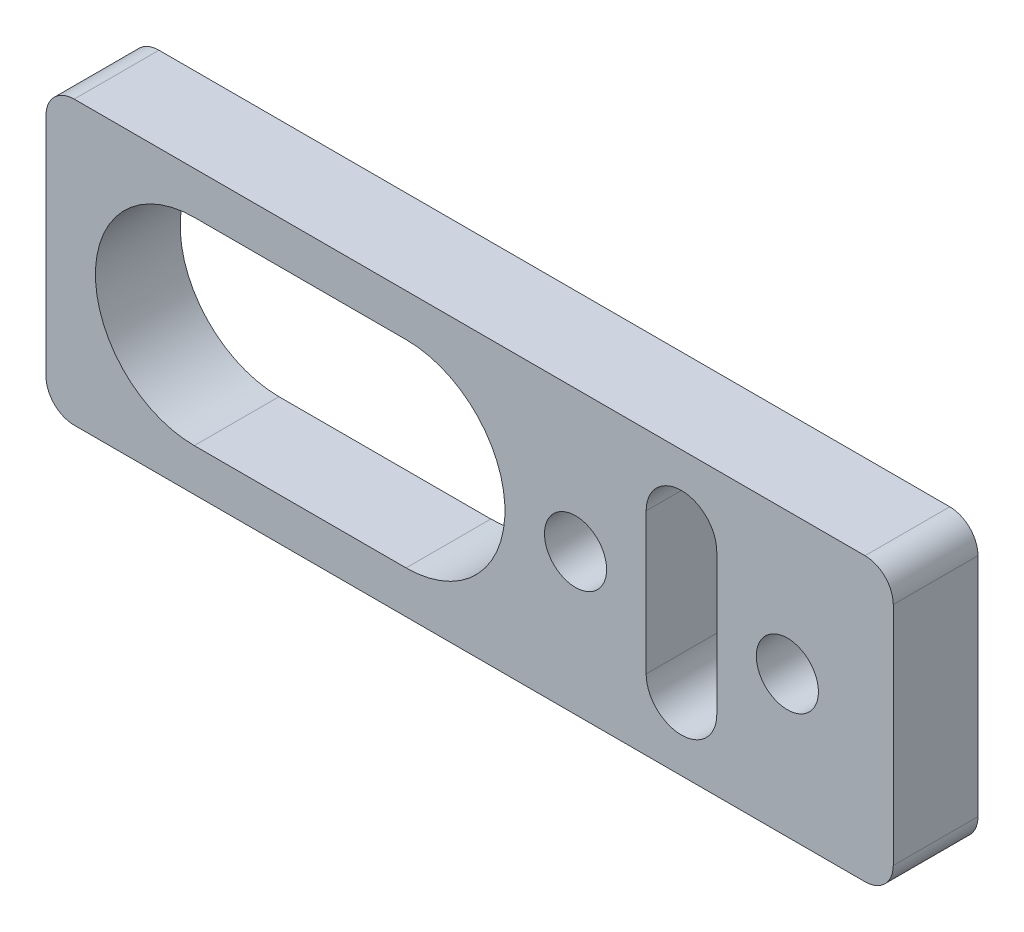
ISO-10303-21;
HEADER;
FILE_DESCRIPTION(('STEP AP214'),'2;1');
FILE_NAME('part.step','',(''),(''),'','','');
FILE_SCHEMA(('AUTOMOTIVE_DESIGN { 1 0 10303 214 1 1 1 1 }'));
ENDSEC;
DATA;
#1=APPLICATION_CONTEXT('core data for automotive mechanical design processes');
#2=APPLICATION_PROTOCOL_DEFINITION('international standard','automotive_design',2000,#1);
#3=PRODUCT_CONTEXT('',#1,'mechanical');
#4=PRODUCT('Part','Part','',(#3));
#5=PRODUCT_RELATED_PRODUCT_CATEGORY('part','',(#4));
#6=PRODUCT_DEFINITION_FORMATION('','',#4);
#7=PRODUCT_DEFINITION_CONTEXT('part definition',#1,'design');
#8=PRODUCT_DEFINITION('design','',#6,#7);
#9=PRODUCT_DEFINITION_SHAPE('','',#8);
#10=(LENGTH_UNIT() NAMED_UNIT(*) SI_UNIT(.MILLI.,.METRE.));
#11=(NAMED_UNIT(*) PLANE_ANGLE_UNIT() SI_UNIT($,.RADIAN.));
#12=(NAMED_UNIT(*) SI_UNIT($,.STERADIAN.) SOLID_ANGLE_UNIT());
#13=UNCERTAINTY_MEASURE_WITH_UNIT(LENGTH_MEASURE(1.E-05),#10,'distance_accuracy_value','');
#14=(GEOMETRIC_REPRESENTATION_CONTEXT(3) GLOBAL_UNCERTAINTY_ASSIGNED_CONTEXT((#13)) GLOBAL_UNIT_ASSIGNED_CONTEXT((#10,
#11,#12)) REPRESENTATION_CONTEXT('',''));
#15=CARTESIAN_POINT('',(0.,0.,0.));
#16=DIRECTION('',(0.,0.,1.));
#17=DIRECTION('',(1.,0.,0.));
#18=AXIS2_PLACEMENT_3D('',#15,#16,#17);
#19=CARTESIAN_POINT('',(30.,-10.,6.));
#20=DIRECTION('',(-1.,0.,0.));
#21=DIRECTION('',(0.,0.,1.));
#22=AXIS2_PLACEMENT_3D('',#19,#20,#21);
#23=PLANE('',#22);
#24=DIRECTION('',(0.,1.,0.));
#25=VECTOR('',#24,1.);
#26=CARTESIAN_POINT('',(30.,-10.,0.));
#27=LINE('',#26,#25);
#28=CARTESIAN_POINT('',(30.,-8.,0.));
#29=VERTEX_POINT('',#28);
#30=CARTESIAN_POINT('',(30.,8.,0.));
#31=VERTEX_POINT('',#30);
#32=EDGE_CURVE('E228',#29,#31,#27,.T.);
#33=ORIENTED_EDGE('',*,*,#32,.T.);
#34=DIRECTION('',(0.,0.,-1.));
#35=VECTOR('',#34,1.);
#36=CARTESIAN_POINT('',(30.,8.,6.));
#37=LINE('',#36,#35);
#38=CARTESIAN_POINT('',(30.,8.,6.));
#39=VERTEX_POINT('',#38);
#40=EDGE_CURVE('E276',#31,#39,#37,.F.);
#41=ORIENTED_EDGE('',*,*,#40,.T.);
#42=DIRECTION('',(0.,1.,0.));
#43=VECTOR('',#42,1.);
#44=CARTESIAN_POINT('',(30.,-10.,6.));
#45=LINE('',#44,#43);
#46=CARTESIAN_POINT('',(30.,-8.,6.));
#47=VERTEX_POINT('',#46);
#48=EDGE_CURVE('E237',#47,#39,#45,.T.);
#49=ORIENTED_EDGE('',*,*,#48,.F.);
#50=DIRECTION('',(0.,0.,-1.));
#51=VECTOR('',#50,1.);
#52=CARTESIAN_POINT('',(30.,-8.,6.));
#53=LINE('',#52,#51);
#54=EDGE_CURVE('E273',#47,#29,#53,.T.);
#55=ORIENTED_EDGE('',*,*,#54,.T.);
#56=EDGE_LOOP('',(#33,#41,#49,#55));
#57=FACE_BOUND('',#56,.T.);
#58=ADVANCED_FACE('F43',(#57),#23,.F.);
#59=CARTESIAN_POINT('',(-30.,10.,6.));
#60=DIRECTION('',(0.,-1.,0.));
#61=DIRECTION('',(0.,0.,-1.));
#62=AXIS2_PLACEMENT_3D('',#59,#60,#61);
#63=PLANE('',#62);
#64=DIRECTION('',(-1.,0.,0.));
#65=VECTOR('',#64,1.);
#66=CARTESIAN_POINT('',(-30.,10.,6.));
#67=LINE('',#66,#65);
#68=CARTESIAN_POINT('',(28.,10.,6.));
#69=VERTEX_POINT('',#68);
#70=CARTESIAN_POINT('',(-28.,10.,6.));
#71=VERTEX_POINT('',#70);
#72=EDGE_CURVE('E240',#69,#71,#67,.T.);
#73=ORIENTED_EDGE('',*,*,#72,.F.);
#74=DIRECTION('',(0.,0.,-1.));
#75=VECTOR('',#74,1.);
#76=CARTESIAN_POINT('',(28.,10.,6.));
#77=LINE('',#76,#75);
#78=CARTESIAN_POINT('',(28.,10.,0.));
#79=VERTEX_POINT('',#78);
#80=EDGE_CURVE('E262',#69,#79,#77,.T.);
#81=ORIENTED_EDGE('',*,*,#80,.T.);
#82=DIRECTION('',(-1.,0.,0.));
#83=VECTOR('',#82,1.);
#84=CARTESIAN_POINT('',(-30.,10.,0.));
#85=LINE('',#84,#83);
#86=CARTESIAN_POINT('',(-28.,10.,0.));
#87=VERTEX_POINT('',#86);
#88=EDGE_CURVE('E253',#79,#87,#85,.T.);
#89=ORIENTED_EDGE('',*,*,#88,.T.);
#90=DIRECTION('',(0.,0.,-1.));
#91=VECTOR('',#90,1.);
#92=CARTESIAN_POINT('',(-28.,10.,6.));
#93=LINE('',#92,#91);
#94=EDGE_CURVE('E250',#87,#71,#93,.F.);
#95=ORIENTED_EDGE('',*,*,#94,.T.);
#96=EDGE_LOOP('',(#73,#81,#89,#95));
#97=FACE_BOUND('',#96,.T.);
#98=ADVANCED_FACE('F326',(#97),#63,.F.);
#99=CARTESIAN_POINT('',(-30.,-10.,6.));
#100=DIRECTION('',(1.,0.,0.));
#101=DIRECTION('',(0.,0.,-1.));
#102=AXIS2_PLACEMENT_3D('',#99,#100,#101);
#103=PLANE('',#102);
#104=DIRECTION('',(0.,-1.,0.));
#105=VECTOR('',#104,1.);
#106=CARTESIAN_POINT('',(-30.,-10.,0.));
#107=LINE('',#106,#105);
#108=CARTESIAN_POINT('',(-30.,8.,0.));
#109=VERTEX_POINT('',#108);
#110=CARTESIAN_POINT('',(-30.,-8.,0.));
#111=VERTEX_POINT('',#110);
#112=EDGE_CURVE('E256',#109,#111,#107,.T.);
#113=ORIENTED_EDGE('',*,*,#112,.T.);
#114=DIRECTION('',(0.,0.,-1.));
#115=VECTOR('',#114,1.);
#116=CARTESIAN_POINT('',(-30.,-8.,6.));
#117=LINE('',#116,#115);
#118=CARTESIAN_POINT('',(-30.,-8.,6.));
#119=VERTEX_POINT('',#118);
#120=EDGE_CURVE('E11',#111,#119,#117,.F.);
#121=ORIENTED_EDGE('',*,*,#120,.T.);
#122=DIRECTION('',(0.,-1.,0.));
#123=VECTOR('',#122,1.);
#124=CARTESIAN_POINT('',(-30.,-10.,6.));
#125=LINE('',#124,#123);
#126=CARTESIAN_POINT('',(-30.,8.,6.));
#127=VERTEX_POINT('',#126);
#128=EDGE_CURVE('E244',#127,#119,#125,.T.);
#129=ORIENTED_EDGE('',*,*,#128,.F.);
#130=DIRECTION('',(0.,0.,-1.));
#131=VECTOR('',#130,1.);
#132=CARTESIAN_POINT('',(-30.,8.,6.));
#133=LINE('',#132,#131);
#134=EDGE_CURVE('E51',#127,#109,#133,.T.);
#135=ORIENTED_EDGE('',*,*,#134,.T.);
#136=EDGE_LOOP('',(#113,#121,#129,#135));
#137=FACE_BOUND('',#136,.T.);
#138=ADVANCED_FACE('F295',(#137),#103,.F.);
#139=CARTESIAN_POINT('',(-30.,-10.,6.));
#140=DIRECTION('',(0.,1.,0.));
#141=DIRECTION('',(0.,0.,1.));
#142=AXIS2_PLACEMENT_3D('',#139,#140,#141);
#143=PLANE('',#142);
#144=DIRECTION('',(1.,0.,0.));
#145=VECTOR('',#144,1.);
#146=CARTESIAN_POINT('',(-30.,-10.,0.));
#147=LINE('',#146,#145);
#148=CARTESIAN_POINT('',(-28.,-10.,0.));
#149=VERTEX_POINT('',#148);
#150=CARTESIAN_POINT('',(28.,-10.,0.));
#151=VERTEX_POINT('',#150);
#152=EDGE_CURVE('E241',#149,#151,#147,.T.);
#153=ORIENTED_EDGE('',*,*,#152,.T.);
#154=DIRECTION('',(0.,0.,-1.));
#155=VECTOR('',#154,1.);
#156=CARTESIAN_POINT('',(28.,-10.,6.));
#157=LINE('',#156,#155);
#158=CARTESIAN_POINT('',(28.,-10.,6.));
#159=VERTEX_POINT('',#158);
#160=EDGE_CURVE('E289',#151,#159,#157,.F.);
#161=ORIENTED_EDGE('',*,*,#160,.T.);
#162=DIRECTION('',(1.,0.,0.));
#163=VECTOR('',#162,1.);
#164=CARTESIAN_POINT('',(-30.,-10.,6.));
#165=LINE('',#164,#163);
#166=CARTESIAN_POINT('',(-28.,-10.,6.));
#167=VERTEX_POINT('',#166);
#168=EDGE_CURVE('E247',#167,#159,#165,.T.);
#169=ORIENTED_EDGE('',*,*,#168,.F.);
#170=DIRECTION('',(0.,0.,-1.));
#171=VECTOR('',#170,1.);
#172=CARTESIAN_POINT('',(-28.,-10.,6.));
#173=LINE('',#172,#171);
#174=EDGE_CURVE('E286',#167,#149,#173,.T.);
#175=ORIENTED_EDGE('',*,*,#174,.T.);
#176=EDGE_LOOP('',(#153,#161,#169,#175));
#177=FACE_BOUND('',#176,.T.);
#178=ADVANCED_FACE('F308',(#177),#143,.F.);
#179=CARTESIAN_POINT('',(0.,0.,6.));
#180=DIRECTION('',(0.,0.,-1.));
#181=DIRECTION('',(-1.,0.,0.));
#182=AXIS2_PLACEMENT_3D('',#179,#180,#181);
#183=PLANE('',#182);
#184=DIRECTION('',(1.,0.,0.));
#185=VECTOR('',#184,1.);
#186=CARTESIAN_POINT('',(-19.5,-7.,6.));
#187=LINE('',#186,#185);
#188=CARTESIAN_POINT('',(-19.5,-7.,6.));
#189=VERTEX_POINT('',#188);
#190=CARTESIAN_POINT('',(-4.5,-7.,6.));
#191=VERTEX_POINT('',#190);
#192=EDGE_CURVE('E185',#189,#191,#187,.T.);
#193=ORIENTED_EDGE('',*,*,#192,.F.);
#194=CARTESIAN_POINT('',(-19.5,0.,6.));
#195=DIRECTION('',(0.,0.,1.));
#196=DIRECTION('',(1.,0.,0.));
#197=AXIS2_PLACEMENT_3D('',#194,#195,#196);
#198=CIRCLE('',#197,7.);
#199=CARTESIAN_POINT('',(-19.5,7.,6.));
#200=VERTEX_POINT('',#199);
#201=EDGE_CURVE('E58',#200,#189,#198,.T.);
#202=ORIENTED_EDGE('',*,*,#201,.F.);
#203=DIRECTION('',(-1.,0.,0.));
#204=VECTOR('',#203,1.);
#205=CARTESIAN_POINT('',(-19.5,7.,6.));
#206=LINE('',#205,#204);
#207=CARTESIAN_POINT('',(-4.5,7.,6.));
#208=VERTEX_POINT('',#207);
#209=EDGE_CURVE('E176',#208,#200,#206,.T.);
#210=ORIENTED_EDGE('',*,*,#209,.F.);
#211=CARTESIAN_POINT('',(-4.5,0.,6.));
#212=DIRECTION('',(0.,0.,1.));
#213=DIRECTION('',(1.,0.,0.));
#214=AXIS2_PLACEMENT_3D('',#211,#212,#213);
#215=CIRCLE('',#214,7.);
#216=EDGE_CURVE('E179',#191,#208,#215,.T.);
#217=ORIENTED_EDGE('',*,*,#216,.F.);
#218=EDGE_LOOP('',(#193,#202,#210,#217));
#219=FACE_BOUND('',#218,.T.);
#220=DIRECTION('',(0.,1.,0.));
#221=VECTOR('',#220,1.);
#222=CARTESIAN_POINT('',(17.5,-5.,6.));
#223=LINE('',#222,#221);
#224=CARTESIAN_POINT('',(17.5,-5.,6.));
#225=VERTEX_POINT('',#224);
#226=CARTESIAN_POINT('',(17.5,5.,6.));
#227=VERTEX_POINT('',#226);
#228=EDGE_CURVE('E211',#225,#227,#223,.T.);
#229=ORIENTED_EDGE('',*,*,#228,.F.);
#230=CARTESIAN_POINT('',(15.,-5.,6.));
#231=DIRECTION('',(0.,0.,1.));
#232=DIRECTION('',(1.,0.,0.));
#233=AXIS2_PLACEMENT_3D('',#230,#231,#232);
#234=CIRCLE('',#233,2.5);
#235=CARTESIAN_POINT('',(12.5,-5.,6.));
#236=VERTEX_POINT('',#235);
#237=EDGE_CURVE('E66',#236,#225,#234,.T.);
#238=ORIENTED_EDGE('',*,*,#237,.F.);
#239=DIRECTION('',(0.,-1.,0.));
#240=VECTOR('',#239,1.);
#241=CARTESIAN_POINT('',(12.5,-5.,6.));
#242=LINE('',#241,#240);
#243=CARTESIAN_POINT('',(12.5,5.,6.));
#244=VERTEX_POINT('',#243);
#245=EDGE_CURVE('E200',#244,#236,#242,.T.);
#246=ORIENTED_EDGE('',*,*,#245,.F.);
#247=CARTESIAN_POINT('',(15.,5.,6.));
#248=DIRECTION('',(0.,0.,1.));
#249=DIRECTION('',(1.,0.,0.));
#250=AXIS2_PLACEMENT_3D('',#247,#248,#249);
#251=CIRCLE('',#250,2.5);
#252=EDGE_CURVE('E214',#227,#244,#251,.T.);
#253=ORIENTED_EDGE('',*,*,#252,.F.);
#254=EDGE_LOOP('',(#229,#238,#246,#253));
#255=FACE_BOUND('',#254,.T.);
#256=CARTESIAN_POINT('',(22.5,0.,6.));
#257=DIRECTION('',(0.,0.,1.));
#258=DIRECTION('',(1.,0.,0.));
#259=AXIS2_PLACEMENT_3D('',#256,#257,#258);
#260=CIRCLE('',#259,2.2);
#261=CARTESIAN_POINT('',(24.7,0.,6.));
#262=VERTEX_POINT('',#261);
#263=EDGE_CURVE('E229',#262,#262,#260,.T.);
#264=ORIENTED_EDGE('',*,*,#263,.F.);
#265=EDGE_LOOP('',(#264));
#266=FACE_BOUND('',#265,.T.);
#267=CARTESIAN_POINT('',(7.5,0.,6.));
#268=DIRECTION('',(0.,0.,1.));
#269=DIRECTION('',(1.,0.,0.));
#270=AXIS2_PLACEMENT_3D('',#267,#268,#269);
#271=CIRCLE('',#270,2.2);
#272=CARTESIAN_POINT('',(9.7,0.,6.));
#273=VERTEX_POINT('',#272);
#274=EDGE_CURVE('E192',#273,#273,#271,.T.);
#275=ORIENTED_EDGE('',*,*,#274,.F.);
#276=EDGE_LOOP('',(#275));
#277=FACE_BOUND('',#276,.T.);
#278=ORIENTED_EDGE('',*,*,#48,.T.);
#279=CARTESIAN_POINT('',(28.,8.,6.));
#280=DIRECTION('',(0.,0.,-1.));
#281=DIRECTION('',(-1.,0.,0.));
#282=AXIS2_PLACEMENT_3D('',#279,#280,#281);
#283=CIRCLE('',#282,2.);
#284=EDGE_CURVE('E284',#39,#69,#283,.F.);
#285=ORIENTED_EDGE('',*,*,#284,.T.);
#286=ORIENTED_EDGE('',*,*,#72,.T.);
#287=CARTESIAN_POINT('',(-28.,8.,6.));
#288=DIRECTION('',(0.,0.,-1.));
#289=DIRECTION('',(-1.,0.,0.));
#290=AXIS2_PLACEMENT_3D('',#287,#288,#289);
#291=CIRCLE('',#290,2.);
#292=EDGE_CURVE('E278',#71,#127,#291,.F.);
#293=ORIENTED_EDGE('',*,*,#292,.T.);
#294=ORIENTED_EDGE('',*,*,#128,.T.);
#295=CARTESIAN_POINT('',(-28.,-8.,6.));
#296=DIRECTION('',(0.,0.,-1.));
#297=DIRECTION('',(-1.,0.,0.));
#298=AXIS2_PLACEMENT_3D('',#295,#296,#297);
#299=CIRCLE('',#298,2.);
#300=EDGE_CURVE('E280',#119,#167,#299,.F.);
#301=ORIENTED_EDGE('',*,*,#300,.T.);
#302=ORIENTED_EDGE('',*,*,#168,.T.);
#303=CARTESIAN_POINT('',(28.,-8.,6.));
#304=DIRECTION('',(0.,0.,-1.));
#305=DIRECTION('',(-1.,0.,0.));
#306=AXIS2_PLACEMENT_3D('',#303,#304,#305);
#307=CIRCLE('',#306,2.);
#308=EDGE_CURVE('E282',#159,#47,#307,.F.);
#309=ORIENTED_EDGE('',*,*,#308,.T.);
#310=EDGE_LOOP('',(#278,#285,#286,#293,#294,#301,#302,#309));
#311=FACE_BOUND('',#310,.T.);
#312=ADVANCED_FACE('F312',(#219,#255,#266,#277,#311),#183,.F.);
#313=CARTESIAN_POINT('',(0.,0.,0.));
#314=DIRECTION('',(0.,0.,-1.));
#315=DIRECTION('',(-1.,0.,0.));
#316=AXIS2_PLACEMENT_3D('',#313,#314,#315);
#317=PLANE('',#316);
#318=CARTESIAN_POINT('',(-19.5,0.,0.));
#319=DIRECTION('',(0.,0.,1.));
#320=DIRECTION('',(1.,0.,0.));
#321=AXIS2_PLACEMENT_3D('',#318,#319,#320);
#322=CIRCLE('',#321,7.);
#323=CARTESIAN_POINT('',(-19.5,7.,0.));
#324=VERTEX_POINT('',#323);
#325=CARTESIAN_POINT('',(-19.5,-7.,0.));
#326=VERTEX_POINT('',#325);
#327=EDGE_CURVE('E157',#324,#326,#322,.T.);
#328=ORIENTED_EDGE('',*,*,#327,.T.);
#329=DIRECTION('',(1.,0.,0.));
#330=VECTOR('',#329,1.);
#331=CARTESIAN_POINT('',(-19.5,-7.,0.));
#332=LINE('',#331,#330);
#333=CARTESIAN_POINT('',(-4.5,-7.,0.));
#334=VERTEX_POINT('',#333);
#335=EDGE_CURVE('E167',#326,#334,#332,.T.);
#336=ORIENTED_EDGE('',*,*,#335,.T.);
#337=CARTESIAN_POINT('',(-4.5,0.,0.));
#338=DIRECTION('',(0.,0.,1.));
#339=DIRECTION('',(1.,0.,0.));
#340=AXIS2_PLACEMENT_3D('',#337,#338,#339);
#341=CIRCLE('',#340,7.);
#342=CARTESIAN_POINT('',(-4.5,7.,0.));
#343=VERTEX_POINT('',#342);
#344=EDGE_CURVE('E171',#334,#343,#341,.T.);
#345=ORIENTED_EDGE('',*,*,#344,.T.);
#346=DIRECTION('',(-1.,0.,0.));
#347=VECTOR('',#346,1.);
#348=CARTESIAN_POINT('',(-19.5,7.,0.));
#349=LINE('',#348,#347);
#350=EDGE_CURVE('E163',#343,#324,#349,.T.);
#351=ORIENTED_EDGE('',*,*,#350,.T.);
#352=EDGE_LOOP('',(#328,#336,#345,#351));
#353=FACE_BOUND('',#352,.T.);
#354=CARTESIAN_POINT('',(15.,-5.,0.));
#355=DIRECTION('',(0.,0.,1.));
#356=DIRECTION('',(1.,0.,0.));
#357=AXIS2_PLACEMENT_3D('',#354,#355,#356);
#358=CIRCLE('',#357,2.5);
#359=CARTESIAN_POINT('',(12.5,-5.,0.));
#360=VERTEX_POINT('',#359);
#361=CARTESIAN_POINT('',(17.5,-5.,0.));
#362=VERTEX_POINT('',#361);
#363=EDGE_CURVE('E196',#360,#362,#358,.T.);
#364=ORIENTED_EDGE('',*,*,#363,.T.);
#365=DIRECTION('',(0.,1.,0.));
#366=VECTOR('',#365,1.);
#367=CARTESIAN_POINT('',(17.5,-5.,0.));
#368=LINE('',#367,#366);
#369=CARTESIAN_POINT('',(17.5,5.,0.));
#370=VERTEX_POINT('',#369);
#371=EDGE_CURVE('E199',#362,#370,#368,.T.);
#372=ORIENTED_EDGE('',*,*,#371,.T.);
#373=CARTESIAN_POINT('',(15.,5.,0.));
#374=DIRECTION('',(0.,0.,1.));
#375=DIRECTION('',(1.,0.,0.));
#376=AXIS2_PLACEMENT_3D('',#373,#374,#375);
#377=CIRCLE('',#376,2.5);
#378=CARTESIAN_POINT('',(12.5,5.,0.));
#379=VERTEX_POINT('',#378);
#380=EDGE_CURVE('E203',#370,#379,#377,.T.);
#381=ORIENTED_EDGE('',*,*,#380,.T.);
#382=DIRECTION('',(0.,-1.,0.));
#383=VECTOR('',#382,1.);
#384=CARTESIAN_POINT('',(12.5,-5.,0.));
#385=LINE('',#384,#383);
#386=EDGE_CURVE('E206',#379,#360,#385,.T.);
#387=ORIENTED_EDGE('',*,*,#386,.T.);
#388=EDGE_LOOP('',(#364,#372,#381,#387));
#389=FACE_BOUND('',#388,.T.);
#390=CARTESIAN_POINT('',(22.5,0.,0.));
#391=DIRECTION('',(0.,0.,1.));
#392=DIRECTION('',(1.,0.,0.));
#393=AXIS2_PLACEMENT_3D('',#390,#391,#392);
#394=CIRCLE('',#393,2.2);
#395=CARTESIAN_POINT('',(24.7,0.,0.));
#396=VERTEX_POINT('',#395);
#397=EDGE_CURVE('E225',#396,#396,#394,.T.);
#398=ORIENTED_EDGE('',*,*,#397,.T.);
#399=EDGE_LOOP('',(#398));
#400=FACE_BOUND('',#399,.T.);
#401=CARTESIAN_POINT('',(7.5,0.,0.));
#402=DIRECTION('',(0.,0.,1.));
#403=DIRECTION('',(1.,0.,0.));
#404=AXIS2_PLACEMENT_3D('',#401,#402,#403);
#405=CIRCLE('',#404,2.2);
#406=CARTESIAN_POINT('',(9.7,0.,0.));
#407=VERTEX_POINT('',#406);
#408=EDGE_CURVE('E232',#407,#407,#405,.T.);
#409=ORIENTED_EDGE('',*,*,#408,.T.);
#410=EDGE_LOOP('',(#409));
#411=FACE_BOUND('',#410,.T.);
#412=ORIENTED_EDGE('',*,*,#88,.F.);
#413=CARTESIAN_POINT('',(28.,8.,0.));
#414=DIRECTION('',(0.,0.,-1.));
#415=DIRECTION('',(-1.,0.,0.));
#416=AXIS2_PLACEMENT_3D('',#413,#414,#415);
#417=CIRCLE('',#416,2.);
#418=EDGE_CURVE('E271',#79,#31,#417,.T.);
#419=ORIENTED_EDGE('',*,*,#418,.T.);
#420=ORIENTED_EDGE('',*,*,#32,.F.);
#421=CARTESIAN_POINT('',(28.,-8.,0.));
#422=DIRECTION('',(0.,0.,-1.));
#423=DIRECTION('',(-1.,0.,0.));
#424=AXIS2_PLACEMENT_3D('',#421,#422,#423);
#425=CIRCLE('',#424,2.);
#426=EDGE_CURVE('E269',#29,#151,#425,.T.);
#427=ORIENTED_EDGE('',*,*,#426,.T.);
#428=ORIENTED_EDGE('',*,*,#152,.F.);
#429=CARTESIAN_POINT('',(-28.,-8.,0.));
#430=DIRECTION('',(0.,0.,-1.));
#431=DIRECTION('',(-1.,0.,0.));
#432=AXIS2_PLACEMENT_3D('',#429,#430,#431);
#433=CIRCLE('',#432,2.);
#434=EDGE_CURVE('E267',#149,#111,#433,.T.);
#435=ORIENTED_EDGE('',*,*,#434,.T.);
#436=ORIENTED_EDGE('',*,*,#112,.F.);
#437=CARTESIAN_POINT('',(-28.,8.,0.));
#438=DIRECTION('',(0.,0.,-1.));
#439=DIRECTION('',(-1.,0.,0.));
#440=AXIS2_PLACEMENT_3D('',#437,#438,#439);
#441=CIRCLE('',#440,2.);
#442=EDGE_CURVE('E265',#109,#87,#441,.T.);
#443=ORIENTED_EDGE('',*,*,#442,.T.);
#444=EDGE_LOOP('',(#412,#419,#420,#427,#428,#435,#436,#443));
#445=FACE_BOUND('',#444,.T.);
#446=ADVANCED_FACE('F173',(#353,#389,#400,#411,#445),#317,.T.);
#447=CARTESIAN_POINT('',(28.,8.,6.));
#448=DIRECTION('',(0.,0.,-1.));
#449=DIRECTION('',(-1.,0.,0.));
#450=AXIS2_PLACEMENT_3D('',#447,#448,#449);
#451=CYLINDRICAL_SURFACE('',#450,2.);
#452=ORIENTED_EDGE('',*,*,#284,.F.);
#453=ORIENTED_EDGE('',*,*,#40,.F.);
#454=ORIENTED_EDGE('',*,*,#418,.F.);
#455=ORIENTED_EDGE('',*,*,#80,.F.);
#456=EDGE_LOOP('',(#452,#453,#454,#455));
#457=FACE_BOUND('',#456,.T.);
#458=ADVANCED_FACE('F323',(#457),#451,.T.);
#459=CARTESIAN_POINT('',(28.,-8.,6.));
#460=DIRECTION('',(0.,0.,-1.));
#461=DIRECTION('',(-1.,0.,0.));
#462=AXIS2_PLACEMENT_3D('',#459,#460,#461);
#463=CYLINDRICAL_SURFACE('',#462,2.);
#464=ORIENTED_EDGE('',*,*,#308,.F.);
#465=ORIENTED_EDGE('',*,*,#160,.F.);
#466=ORIENTED_EDGE('',*,*,#426,.F.);
#467=ORIENTED_EDGE('',*,*,#54,.F.);
#468=EDGE_LOOP('',(#464,#465,#466,#467));
#469=FACE_BOUND('',#468,.T.);
#470=ADVANCED_FACE('F316',(#469),#463,.T.);
#471=CARTESIAN_POINT('',(-28.,-8.,6.));
#472=DIRECTION('',(0.,0.,-1.));
#473=DIRECTION('',(-1.,0.,0.));
#474=AXIS2_PLACEMENT_3D('',#471,#472,#473);
#475=CYLINDRICAL_SURFACE('',#474,2.);
#476=ORIENTED_EDGE('',*,*,#300,.F.);
#477=ORIENTED_EDGE('',*,*,#120,.F.);
#478=ORIENTED_EDGE('',*,*,#434,.F.);
#479=ORIENTED_EDGE('',*,*,#174,.F.);
#480=EDGE_LOOP('',(#476,#477,#478,#479));
#481=FACE_BOUND('',#480,.T.);
#482=ADVANCED_FACE('F305',(#481),#475,.T.);
#483=CARTESIAN_POINT('',(-28.,8.,6.));
#484=DIRECTION('',(0.,0.,-1.));
#485=DIRECTION('',(-1.,0.,0.));
#486=AXIS2_PLACEMENT_3D('',#483,#484,#485);
#487=CYLINDRICAL_SURFACE('',#486,2.);
#488=ORIENTED_EDGE('',*,*,#292,.F.);
#489=ORIENTED_EDGE('',*,*,#94,.F.);
#490=ORIENTED_EDGE('',*,*,#442,.F.);
#491=ORIENTED_EDGE('',*,*,#134,.F.);
#492=EDGE_LOOP('',(#488,#489,#490,#491));
#493=FACE_BOUND('',#492,.T.);
#494=ADVANCED_FACE('F45',(#493),#487,.T.);
#495=CARTESIAN_POINT('',(7.5,0.,0.));
#496=DIRECTION('',(0.,0.,1.));
#497=DIRECTION('',(1.,0.,0.));
#498=AXIS2_PLACEMENT_3D('',#495,#496,#497);
#499=CYLINDRICAL_SURFACE('',#498,2.2);
#500=ORIENTED_EDGE('',*,*,#408,.F.);
#501=EDGE_LOOP('',(#500));
#502=FACE_BOUND('',#501,.T.);
#503=ORIENTED_EDGE('',*,*,#274,.T.);
#504=EDGE_LOOP('',(#503));
#505=FACE_BOUND('',#504,.T.);
#506=ADVANCED_FACE('F329',(#502,#505),#499,.F.);
#507=CARTESIAN_POINT('',(22.5,0.,0.));
#508=DIRECTION('',(0.,0.,1.));
#509=DIRECTION('',(1.,0.,0.));
#510=AXIS2_PLACEMENT_3D('',#507,#508,#509);
#511=CYLINDRICAL_SURFACE('',#510,2.2);
#512=ORIENTED_EDGE('',*,*,#397,.F.);
#513=EDGE_LOOP('',(#512));
#514=FACE_BOUND('',#513,.T.);
#515=ORIENTED_EDGE('',*,*,#263,.T.);
#516=EDGE_LOOP('',(#515));
#517=FACE_BOUND('',#516,.T.);
#518=ADVANCED_FACE('F334',(#514,#517),#511,.F.);
#519=CARTESIAN_POINT('',(15.,-5.,0.));
#520=DIRECTION('',(0.,0.,1.));
#521=DIRECTION('',(1.,0.,0.));
#522=AXIS2_PLACEMENT_3D('',#519,#520,#521);
#523=CYLINDRICAL_SURFACE('',#522,2.5);
#524=ORIENTED_EDGE('',*,*,#237,.T.);
#525=DIRECTION('',(0.,0.,1.));
#526=VECTOR('',#525,1.);
#527=CARTESIAN_POINT('',(17.5,-5.,0.));
#528=LINE('',#527,#526);
#529=EDGE_CURVE('E209',#362,#225,#528,.T.);
#530=ORIENTED_EDGE('',*,*,#529,.F.);
#531=ORIENTED_EDGE('',*,*,#363,.F.);
#532=DIRECTION('',(0.,0.,1.));
#533=VECTOR('',#532,1.);
#534=CARTESIAN_POINT('',(12.5,-5.,0.));
#535=LINE('',#534,#533);
#536=EDGE_CURVE('E186',#360,#236,#535,.T.);
#537=ORIENTED_EDGE('',*,*,#536,.T.);
#538=EDGE_LOOP('',(#524,#530,#531,#537));
#539=FACE_BOUND('',#538,.T.);
#540=ADVANCED_FACE('F378',(#539),#523,.F.);
#541=CARTESIAN_POINT('',(12.5,-5.,0.));
#542=DIRECTION('',(-1.,0.,0.));
#543=DIRECTION('',(0.,0.,1.));
#544=AXIS2_PLACEMENT_3D('',#541,#542,#543);
#545=PLANE('',#544);
#546=ORIENTED_EDGE('',*,*,#245,.T.);
#547=ORIENTED_EDGE('',*,*,#536,.F.);
#548=ORIENTED_EDGE('',*,*,#386,.F.);
#549=DIRECTION('',(0.,0.,1.));
#550=VECTOR('',#549,1.);
#551=CARTESIAN_POINT('',(12.5,5.,0.));
#552=LINE('',#551,#550);
#553=EDGE_CURVE('E220',#379,#244,#552,.T.);
#554=ORIENTED_EDGE('',*,*,#553,.T.);
#555=EDGE_LOOP('',(#546,#547,#548,#554));
#556=FACE_BOUND('',#555,.T.);
#557=ADVANCED_FACE('F389',(#556),#545,.F.);
#558=CARTESIAN_POINT('',(15.,5.,0.));
#559=DIRECTION('',(0.,0.,1.));
#560=DIRECTION('',(1.,0.,0.));
#561=AXIS2_PLACEMENT_3D('',#558,#559,#560);
#562=CYLINDRICAL_SURFACE('',#561,2.5);
#563=ORIENTED_EDGE('',*,*,#252,.T.);
#564=ORIENTED_EDGE('',*,*,#553,.F.);
#565=ORIENTED_EDGE('',*,*,#380,.F.);
#566=DIRECTION('',(0.,0.,1.));
#567=VECTOR('',#566,1.);
#568=CARTESIAN_POINT('',(17.5,5.,0.));
#569=LINE('',#568,#567);
#570=EDGE_CURVE('E222',#370,#227,#569,.T.);
#571=ORIENTED_EDGE('',*,*,#570,.T.);
#572=EDGE_LOOP('',(#563,#564,#565,#571));
#573=FACE_BOUND('',#572,.T.);
#574=ADVANCED_FACE('F399',(#573),#562,.F.);
#575=CARTESIAN_POINT('',(17.5,-5.,0.));
#576=DIRECTION('',(1.,0.,0.));
#577=DIRECTION('',(0.,0.,-1.));
#578=AXIS2_PLACEMENT_3D('',#575,#576,#577);
#579=PLANE('',#578);
#580=ORIENTED_EDGE('',*,*,#228,.T.);
#581=ORIENTED_EDGE('',*,*,#570,.F.);
#582=ORIENTED_EDGE('',*,*,#371,.F.);
#583=ORIENTED_EDGE('',*,*,#529,.T.);
#584=EDGE_LOOP('',(#580,#581,#582,#583));
#585=FACE_BOUND('',#584,.T.);
#586=ADVANCED_FACE('F409',(#585),#579,.F.);
#587=CARTESIAN_POINT('',(-19.5,0.,0.));
#588=DIRECTION('',(0.,0.,1.));
#589=DIRECTION('',(1.,0.,0.));
#590=AXIS2_PLACEMENT_3D('',#587,#588,#589);
#591=CYLINDRICAL_SURFACE('',#590,7.);
#592=ORIENTED_EDGE('',*,*,#201,.T.);
#593=DIRECTION('',(0.,0.,1.));
#594=VECTOR('',#593,1.);
#595=CARTESIAN_POINT('',(-19.5,-7.,0.));
#596=LINE('',#595,#594);
#597=EDGE_CURVE('E153',#326,#189,#596,.T.);
#598=ORIENTED_EDGE('',*,*,#597,.F.);
#599=ORIENTED_EDGE('',*,*,#327,.F.);
#600=DIRECTION('',(0.,0.,1.));
#601=VECTOR('',#600,1.);
#602=CARTESIAN_POINT('',(-19.5,7.,0.));
#603=LINE('',#602,#601);
#604=EDGE_CURVE('E190',#324,#200,#603,.T.);
#605=ORIENTED_EDGE('',*,*,#604,.T.);
#606=EDGE_LOOP('',(#592,#598,#599,#605));
#607=FACE_BOUND('',#606,.T.);
#608=ADVANCED_FACE('F155',(#607),#591,.F.);
#609=CARTESIAN_POINT('',(-19.5,7.,0.));
#610=DIRECTION('',(0.,1.,0.));
#611=DIRECTION('',(-1.,0.,0.));
#612=AXIS2_PLACEMENT_3D('',#609,#610,#611);
#613=PLANE('',#612);
#614=ORIENTED_EDGE('',*,*,#209,.T.);
#615=ORIENTED_EDGE('',*,*,#604,.F.);
#616=ORIENTED_EDGE('',*,*,#350,.F.);
#617=DIRECTION('',(0.,0.,1.));
#618=VECTOR('',#617,1.);
#619=CARTESIAN_POINT('',(-4.5,7.,0.));
#620=LINE('',#619,#618);
#621=EDGE_CURVE('E193',#343,#208,#620,.T.);
#622=ORIENTED_EDGE('',*,*,#621,.T.);
#623=EDGE_LOOP('',(#614,#615,#616,#622));
#624=FACE_BOUND('',#623,.T.);
#625=ADVANCED_FACE('F428',(#624),#613,.F.);
#626=CARTESIAN_POINT('',(-4.5,0.,0.));
#627=DIRECTION('',(0.,0.,1.));
#628=DIRECTION('',(1.,0.,0.));
#629=AXIS2_PLACEMENT_3D('',#626,#627,#628);
#630=CYLINDRICAL_SURFACE('',#629,7.);
#631=ORIENTED_EDGE('',*,*,#216,.T.);
#632=ORIENTED_EDGE('',*,*,#621,.F.);
#633=ORIENTED_EDGE('',*,*,#344,.F.);
#634=DIRECTION('',(0.,0.,1.));
#635=VECTOR('',#634,1.);
#636=CARTESIAN_POINT('',(-4.5,-7.,0.));
#637=LINE('',#636,#635);
#638=EDGE_CURVE('E162',#334,#191,#637,.T.);
#639=ORIENTED_EDGE('',*,*,#638,.T.);
#640=EDGE_LOOP('',(#631,#632,#633,#639));
#641=FACE_BOUND('',#640,.T.);
#642=ADVANCED_FACE('F437',(#641),#630,.F.);
#643=CARTESIAN_POINT('',(-19.5,-7.,0.));
#644=DIRECTION('',(0.,-1.,0.));
#645=DIRECTION('',(1.,0.,0.));
#646=AXIS2_PLACEMENT_3D('',#643,#644,#645);
#647=PLANE('',#646);
#648=ORIENTED_EDGE('',*,*,#192,.T.);
#649=ORIENTED_EDGE('',*,*,#638,.F.);
#650=ORIENTED_EDGE('',*,*,#335,.F.);
#651=ORIENTED_EDGE('',*,*,#597,.T.);
#652=EDGE_LOOP('',(#648,#649,#650,#651));
#653=FACE_BOUND('',#652,.T.);
#654=ADVANCED_FACE('F168',(#653),#647,.F.);
#655=CLOSED_SHELL('',(#58,#98,#138,#178,#312,#446,#458,#470,#482,#494,#506,#518,#540,#557,#574,
#586,#608,#625,#642,#654));
#656=MANIFOLD_SOLID_BREP('B2',#655);
#657=ADVANCED_BREP_SHAPE_REPRESENTATION('',(#18,#656),#14);
#658=SHAPE_DEFINITION_REPRESENTATION(#9,#657);
ENDSEC;
END-ISO-10303-21;
